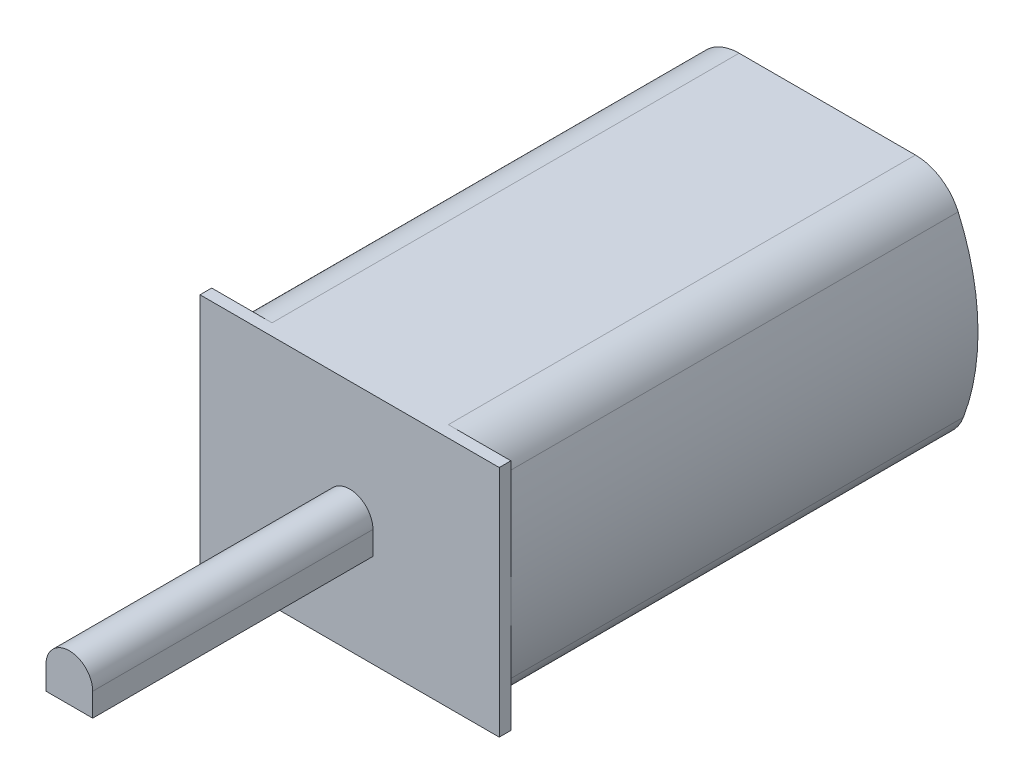
ISO-10303-21;
HEADER;
FILE_DESCRIPTION(('STEP AP214'),'2;1');
FILE_NAME('part.step','',(''),(''),'','','');
FILE_SCHEMA(('AUTOMOTIVE_DESIGN { 1 0 10303 214 1 1 1 1 }'));
ENDSEC;
DATA;
#1=APPLICATION_CONTEXT('core data for automotive mechanical design processes');
#2=APPLICATION_PROTOCOL_DEFINITION('international standard','automotive_design',2000,#1);
#3=PRODUCT_CONTEXT('',#1,'mechanical');
#4=PRODUCT('Part','Part','',(#3));
#5=PRODUCT_RELATED_PRODUCT_CATEGORY('part','',(#4));
#6=PRODUCT_DEFINITION_FORMATION('','',#4);
#7=PRODUCT_DEFINITION_CONTEXT('part definition',#1,'design');
#8=PRODUCT_DEFINITION('design','',#6,#7);
#9=PRODUCT_DEFINITION_SHAPE('','',#8);
#10=(LENGTH_UNIT() NAMED_UNIT(*) SI_UNIT(.MILLI.,.METRE.));
#11=(NAMED_UNIT(*) PLANE_ANGLE_UNIT() SI_UNIT($,.RADIAN.));
#12=(NAMED_UNIT(*) SI_UNIT($,.STERADIAN.) SOLID_ANGLE_UNIT());
#13=UNCERTAINTY_MEASURE_WITH_UNIT(LENGTH_MEASURE(1.E-05),#10,'distance_accuracy_value','');
#14=(GEOMETRIC_REPRESENTATION_CONTEXT(3) GLOBAL_UNCERTAINTY_ASSIGNED_CONTEXT((#13)) GLOBAL_UNIT_ASSIGNED_CONTEXT((#10,
#11,#12)) REPRESENTATION_CONTEXT('',''));
#15=CARTESIAN_POINT('',(0.,0.,0.));
#16=DIRECTION('',(0.,0.,1.));
#17=DIRECTION('',(1.,0.,0.));
#18=AXIS2_PLACEMENT_3D('',#15,#16,#17);
#19=CARTESIAN_POINT('',(8.79469161528333,8.,20.));
#20=DIRECTION('',(0.,0.,-1.));
#21=DIRECTION('',(-1.,0.,0.));
#22=AXIS2_PLACEMENT_3D('',#19,#20,#21);
#23=CYLINDRICAL_SURFACE('',#22,2.);
#24=CARTESIAN_POINT('',(8.79469161528333,8.,0.));
#25=DIRECTION('',(0.,0.,1.));
#26=DIRECTION('',(-1.,0.,0.));
#27=AXIS2_PLACEMENT_3D('',#24,#25,#26);
#28=CIRCLE('',#27,2.);
#29=CARTESIAN_POINT('',(10.6250293599266,8.80614126586724,0.));
#30=VERTEX_POINT('',#29);
#31=CARTESIAN_POINT('',(8.79469161528333,10.,0.));
#32=VERTEX_POINT('',#31);
#33=EDGE_CURVE('E223',#30,#32,#28,.T.);
#34=ORIENTED_EDGE('',*,*,#33,.T.);
#35=DIRECTION('',(0.,0.,-1.));
#36=VECTOR('',#35,1.);
#37=CARTESIAN_POINT('',(8.79469161528333,10.,20.));
#38=LINE('',#37,#36);
#39=CARTESIAN_POINT('',(8.79469161528333,10.,20.));
#40=VERTEX_POINT('',#39);
#41=EDGE_CURVE('E11',#40,#32,#38,.T.);
#42=ORIENTED_EDGE('',*,*,#41,.F.);
#43=CARTESIAN_POINT('',(8.79469161528333,8.,20.));
#44=DIRECTION('',(0.,0.,1.));
#45=DIRECTION('',(-1.,0.,0.));
#46=AXIS2_PLACEMENT_3D('',#43,#44,#45);
#47=CIRCLE('',#46,2.);
#48=CARTESIAN_POINT('',(10.6250293599266,8.80614126586724,20.));
#49=VERTEX_POINT('',#48);
#50=EDGE_CURVE('E224',#49,#40,#47,.T.);
#51=ORIENTED_EDGE('',*,*,#50,.F.);
#52=DIRECTION('',(0.,0.,-1.));
#53=VECTOR('',#52,1.);
#54=CARTESIAN_POINT('',(10.6250293599266,8.80614126586724,20.));
#55=LINE('',#54,#53);
#56=EDGE_CURVE('E243',#49,#30,#55,.T.);
#57=ORIENTED_EDGE('',*,*,#56,.T.);
#58=EDGE_LOOP('',(#34,#42,#51,#57));
#59=FACE_BOUND('',#58,.T.);
#60=ADVANCED_FACE('F36',(#59),#23,.T.);
#61=CARTESIAN_POINT('',(1.24405555074872,10.,20.));
#62=DIRECTION('',(0.,-1.,0.));
#63=DIRECTION('',(0.,0.,-1.));
#64=AXIS2_PLACEMENT_3D('',#61,#62,#63);
#65=PLANE('',#64);
#66=DIRECTION('',(-1.,0.,0.));
#67=VECTOR('',#66,1.);
#68=CARTESIAN_POINT('',(1.24405555074872,10.,0.));
#69=LINE('',#68,#67);
#70=CARTESIAN_POINT('',(1.24405555074872,10.,0.));
#71=VERTEX_POINT('',#70);
#72=EDGE_CURVE('E246',#32,#71,#69,.T.);
#73=ORIENTED_EDGE('',*,*,#72,.T.);
#74=DIRECTION('',(0.,0.,-1.));
#75=VECTOR('',#74,1.);
#76=CARTESIAN_POINT('',(1.24405555074872,10.,20.));
#77=LINE('',#76,#75);
#78=CARTESIAN_POINT('',(1.24405555074872,10.,20.));
#79=VERTEX_POINT('',#78);
#80=EDGE_CURVE('E43',#79,#71,#77,.T.);
#81=ORIENTED_EDGE('',*,*,#80,.F.);
#82=DIRECTION('',(1.,0.,0.));
#83=VECTOR('',#82,1.);
#84=CARTESIAN_POINT('',(0.,10.,20.));
#85=LINE('',#84,#83);
#86=CARTESIAN_POINT('',(-1.33974596215561,10.,20.));
#87=VERTEX_POINT('',#86);
#88=EDGE_CURVE('E203',#87,#79,#85,.T.);
#89=ORIENTED_EDGE('',*,*,#88,.F.);
#90=DIRECTION('',(0.,0.,-1.));
#91=VECTOR('',#90,1.);
#92=CARTESIAN_POINT('',(-1.33974596215561,10.,20.5));
#93=LINE('',#92,#91);
#94=CARTESIAN_POINT('',(-1.33974596215561,10.,20.5));
#95=VERTEX_POINT('',#94);
#96=EDGE_CURVE('E217',#95,#87,#93,.T.);
#97=ORIENTED_EDGE('',*,*,#96,.F.);
#98=DIRECTION('',(1.,0.,0.));
#99=VECTOR('',#98,1.);
#100=CARTESIAN_POINT('',(0.,10.,20.5));
#101=LINE('',#100,#99);
#102=CARTESIAN_POINT('',(11.4733406367101,10.,20.5));
#103=VERTEX_POINT('',#102);
#104=EDGE_CURVE('E191',#95,#103,#101,.T.);
#105=ORIENTED_EDGE('',*,*,#104,.T.);
#106=DIRECTION('',(0.,0.,-1.));
#107=VECTOR('',#106,1.);
#108=CARTESIAN_POINT('',(11.4733406367101,10.,20.5));
#109=LINE('',#108,#107);
#110=CARTESIAN_POINT('',(11.4733406367101,10.,20.));
#111=VERTEX_POINT('',#110);
#112=EDGE_CURVE('E220',#103,#111,#109,.T.);
#113=ORIENTED_EDGE('',*,*,#112,.T.);
#114=EDGE_CURVE('E202',#40,#111,#85,.T.);
#115=ORIENTED_EDGE('',*,*,#114,.F.);
#116=ORIENTED_EDGE('',*,*,#41,.T.);
#117=EDGE_LOOP('',(#73,#81,#89,#97,#105,#113,#115,#116));
#118=FACE_BOUND('',#117,.T.);
#119=ADVANCED_FACE('F306',(#118),#65,.F.);
#120=CARTESIAN_POINT('',(1.24405555074872,8.,20.));
#121=DIRECTION('',(0.,0.,-1.));
#122=DIRECTION('',(-1.,0.,0.));
#123=AXIS2_PLACEMENT_3D('',#120,#121,#122);
#124=CYLINDRICAL_SURFACE('',#123,2.);
#125=CARTESIAN_POINT('',(1.24405555074872,8.,0.));
#126=DIRECTION('',(0.,0.,1.));
#127=DIRECTION('',(-1.,0.,0.));
#128=AXIS2_PLACEMENT_3D('',#125,#126,#127);
#129=CIRCLE('',#128,2.);
#130=CARTESIAN_POINT('',(-0.609994071025193,8.75,0.));
#131=VERTEX_POINT('',#130);
#132=EDGE_CURVE('E248',#71,#131,#129,.T.);
#133=ORIENTED_EDGE('',*,*,#132,.T.);
#134=DIRECTION('',(0.,0.,-1.));
#135=VECTOR('',#134,1.);
#136=CARTESIAN_POINT('',(-0.609994071025193,8.75,20.));
#137=LINE('',#136,#135);
#138=CARTESIAN_POINT('',(-0.609994071025193,8.75,20.));
#139=VERTEX_POINT('',#138);
#140=EDGE_CURVE('E273',#139,#131,#137,.T.);
#141=ORIENTED_EDGE('',*,*,#140,.F.);
#142=CARTESIAN_POINT('',(1.24405555074872,8.,20.));
#143=DIRECTION('',(0.,0.,1.));
#144=DIRECTION('',(-1.,0.,0.));
#145=AXIS2_PLACEMENT_3D('',#142,#143,#144);
#146=CIRCLE('',#145,2.);
#147=EDGE_CURVE('E227',#79,#139,#146,.T.);
#148=ORIENTED_EDGE('',*,*,#147,.F.);
#149=ORIENTED_EDGE('',*,*,#80,.T.);
#150=EDGE_LOOP('',(#133,#141,#148,#149));
#151=FACE_BOUND('',#150,.T.);
#152=ADVANCED_FACE('F279',(#151),#124,.T.);
#153=CARTESIAN_POINT('',(8.66025403784439,5.,20.));
#154=DIRECTION('',(0.,0.,-1.));
#155=DIRECTION('',(-1.,0.,0.));
#156=AXIS2_PLACEMENT_3D('',#153,#154,#155);
#157=CYLINDRICAL_SURFACE('',#156,10.);
#158=CARTESIAN_POINT('',(8.66025403784439,5.,0.));
#159=DIRECTION('',(0.,0.,1.));
#160=DIRECTION('',(-1.,0.,0.));
#161=AXIS2_PLACEMENT_3D('',#158,#159,#160);
#162=CIRCLE('',#161,10.);
#163=CARTESIAN_POINT('',(-0.609994071025192,1.25,0.));
#164=VERTEX_POINT('',#163);
#165=EDGE_CURVE('E250',#131,#164,#162,.T.);
#166=ORIENTED_EDGE('',*,*,#165,.T.);
#167=DIRECTION('',(0.,0.,-1.));
#168=VECTOR('',#167,1.);
#169=CARTESIAN_POINT('',(-0.609994071025192,1.25,20.));
#170=LINE('',#169,#168);
#171=CARTESIAN_POINT('',(-0.609994071025192,1.25,20.));
#172=VERTEX_POINT('',#171);
#173=EDGE_CURVE('E270',#172,#164,#170,.T.);
#174=ORIENTED_EDGE('',*,*,#173,.F.);
#175=CARTESIAN_POINT('',(8.66025403784439,5.,20.));
#176=DIRECTION('',(0.,0.,1.));
#177=DIRECTION('',(-1.,0.,0.));
#178=AXIS2_PLACEMENT_3D('',#175,#176,#177);
#179=CIRCLE('',#178,10.);
#180=CARTESIAN_POINT('',(-1.33974596215561,5.,20.));
#181=VERTEX_POINT('',#180);
#182=EDGE_CURVE('E231',#181,#172,#179,.T.);
#183=ORIENTED_EDGE('',*,*,#182,.F.);
#184=EDGE_CURVE('E232',#139,#181,#179,.T.);
#185=ORIENTED_EDGE('',*,*,#184,.F.);
#186=ORIENTED_EDGE('',*,*,#140,.T.);
#187=EDGE_LOOP('',(#166,#174,#183,#185,#186));
#188=FACE_BOUND('',#187,.T.);
#189=ADVANCED_FACE('F289',(#188),#157,.T.);
#190=CARTESIAN_POINT('',(1.24405555074872,2.,20.));
#191=DIRECTION('',(0.,0.,-1.));
#192=DIRECTION('',(-1.,0.,0.));
#193=AXIS2_PLACEMENT_3D('',#190,#191,#192);
#194=CYLINDRICAL_SURFACE('',#193,2.);
#195=CARTESIAN_POINT('',(1.24405555074872,2.,0.));
#196=DIRECTION('',(0.,0.,1.));
#197=DIRECTION('',(-1.,0.,0.));
#198=AXIS2_PLACEMENT_3D('',#195,#196,#197);
#199=CIRCLE('',#198,2.);
#200=CARTESIAN_POINT('',(1.24405555074872,0.,0.));
#201=VERTEX_POINT('',#200);
#202=EDGE_CURVE('E252',#164,#201,#199,.T.);
#203=ORIENTED_EDGE('',*,*,#202,.T.);
#204=DIRECTION('',(0.,0.,-1.));
#205=VECTOR('',#204,1.);
#206=CARTESIAN_POINT('',(1.24405555074872,0.,20.));
#207=LINE('',#206,#205);
#208=CARTESIAN_POINT('',(1.24405555074872,0.,20.));
#209=VERTEX_POINT('',#208);
#210=EDGE_CURVE('E267',#209,#201,#207,.T.);
#211=ORIENTED_EDGE('',*,*,#210,.F.);
#212=CARTESIAN_POINT('',(1.24405555074872,2.,20.));
#213=DIRECTION('',(0.,0.,1.));
#214=DIRECTION('',(-1.,0.,0.));
#215=AXIS2_PLACEMENT_3D('',#212,#213,#214);
#216=CIRCLE('',#215,2.);
#217=EDGE_CURVE('E235',#172,#209,#216,.T.);
#218=ORIENTED_EDGE('',*,*,#217,.F.);
#219=ORIENTED_EDGE('',*,*,#173,.T.);
#220=EDGE_LOOP('',(#203,#211,#218,#219));
#221=FACE_BOUND('',#220,.T.);
#222=ADVANCED_FACE('F293',(#221),#194,.T.);
#223=CARTESIAN_POINT('',(1.24405555074872,0.,20.));
#224=DIRECTION('',(0.,1.,0.));
#225=DIRECTION('',(0.,0.,1.));
#226=AXIS2_PLACEMENT_3D('',#223,#224,#225);
#227=PLANE('',#226);
#228=DIRECTION('',(1.,0.,0.));
#229=VECTOR('',#228,1.);
#230=CARTESIAN_POINT('',(1.24405555074872,0.,0.));
#231=LINE('',#230,#229);
#232=CARTESIAN_POINT('',(8.97647071109124,0.,0.));
#233=VERTEX_POINT('',#232);
#234=EDGE_CURVE('E254',#201,#233,#231,.T.);
#235=ORIENTED_EDGE('',*,*,#234,.T.);
#236=DIRECTION('',(0.,0.,-1.));
#237=VECTOR('',#236,1.);
#238=CARTESIAN_POINT('',(8.97647071109124,0.,20.));
#239=LINE('',#238,#237);
#240=CARTESIAN_POINT('',(8.97647071109124,0.,20.));
#241=VERTEX_POINT('',#240);
#242=EDGE_CURVE('E264',#241,#233,#239,.T.);
#243=ORIENTED_EDGE('',*,*,#242,.F.);
#244=DIRECTION('',(1.,0.,0.));
#245=VECTOR('',#244,1.);
#246=CARTESIAN_POINT('',(0.,0.,20.));
#247=LINE('',#246,#245);
#248=CARTESIAN_POINT('',(11.4733406367101,0.,20.));
#249=VERTEX_POINT('',#248);
#250=EDGE_CURVE('E210',#241,#249,#247,.T.);
#251=ORIENTED_EDGE('',*,*,#250,.T.);
#252=DIRECTION('',(0.,0.,-1.));
#253=VECTOR('',#252,1.);
#254=CARTESIAN_POINT('',(11.4733406367101,0.,20.5));
#255=LINE('',#254,#253);
#256=CARTESIAN_POINT('',(11.4733406367101,0.,20.5));
#257=VERTEX_POINT('',#256);
#258=EDGE_CURVE('E199',#257,#249,#255,.T.);
#259=ORIENTED_EDGE('',*,*,#258,.F.);
#260=DIRECTION('',(1.,0.,0.));
#261=VECTOR('',#260,1.);
#262=CARTESIAN_POINT('',(0.,0.,20.5));
#263=LINE('',#262,#261);
#264=CARTESIAN_POINT('',(-1.33974596215561,0.,20.5));
#265=VERTEX_POINT('',#264);
#266=EDGE_CURVE('E198',#265,#257,#263,.T.);
#267=ORIENTED_EDGE('',*,*,#266,.F.);
#268=DIRECTION('',(0.,0.,-1.));
#269=VECTOR('',#268,1.);
#270=CARTESIAN_POINT('',(-1.33974596215561,0.,20.5));
#271=LINE('',#270,#269);
#272=CARTESIAN_POINT('',(-1.33974596215561,0.,20.));
#273=VERTEX_POINT('',#272);
#274=EDGE_CURVE('E215',#265,#273,#271,.T.);
#275=ORIENTED_EDGE('',*,*,#274,.T.);
#276=EDGE_CURVE('E192',#273,#209,#247,.T.);
#277=ORIENTED_EDGE('',*,*,#276,.T.);
#278=ORIENTED_EDGE('',*,*,#210,.T.);
#279=EDGE_LOOP('',(#235,#243,#251,#259,#267,#275,#277,#278));
#280=FACE_BOUND('',#279,.T.);
#281=ADVANCED_FACE('F319',(#280),#227,.F.);
#282=CARTESIAN_POINT('',(8.97647071109124,2.,20.));
#283=DIRECTION('',(0.,0.,-1.));
#284=DIRECTION('',(-1.,0.,0.));
#285=AXIS2_PLACEMENT_3D('',#282,#283,#284);
#286=CYLINDRICAL_SURFACE('',#285,2.);
#287=CARTESIAN_POINT('',(8.97647071109124,2.,0.));
#288=DIRECTION('',(0.,0.,1.));
#289=DIRECTION('',(1.,0.,0.));
#290=AXIS2_PLACEMENT_3D('',#287,#288,#289);
#291=CIRCLE('',#290,2.);
#292=CARTESIAN_POINT('',(10.8522532296865,1.30614126586724,0.));
#293=VERTEX_POINT('',#292);
#294=EDGE_CURVE('E256',#233,#293,#291,.T.);
#295=ORIENTED_EDGE('',*,*,#294,.T.);
#296=DIRECTION('',(0.,0.,-1.));
#297=VECTOR('',#296,1.);
#298=CARTESIAN_POINT('',(10.8522532296865,1.30614126586724,20.));
#299=LINE('',#298,#297);
#300=CARTESIAN_POINT('',(10.8522532296865,1.30614126586724,20.));
#301=VERTEX_POINT('',#300);
#302=EDGE_CURVE('E261',#301,#293,#299,.T.);
#303=ORIENTED_EDGE('',*,*,#302,.F.);
#304=CARTESIAN_POINT('',(8.97647071109124,2.,20.));
#305=DIRECTION('',(0.,0.,1.));
#306=DIRECTION('',(1.,0.,0.));
#307=AXIS2_PLACEMENT_3D('',#304,#305,#306);
#308=CIRCLE('',#307,2.);
#309=EDGE_CURVE('E238',#241,#301,#308,.T.);
#310=ORIENTED_EDGE('',*,*,#309,.F.);
#311=ORIENTED_EDGE('',*,*,#242,.T.);
#312=EDGE_LOOP('',(#295,#303,#310,#311));
#313=FACE_BOUND('',#312,.T.);
#314=ADVANCED_FACE('F322',(#313),#286,.T.);
#315=CARTESIAN_POINT('',(1.47334063671008,4.77543493653104,20.));
#316=DIRECTION('',(0.,0.,-1.));
#317=DIRECTION('',(-1.,0.,0.));
#318=AXIS2_PLACEMENT_3D('',#315,#316,#317);
#319=CYLINDRICAL_SURFACE('',#318,10.);
#320=CARTESIAN_POINT('',(1.47334063671008,4.77543493653104,0.));
#321=DIRECTION('',(0.,0.,1.));
#322=DIRECTION('',(1.,0.,0.));
#323=AXIS2_PLACEMENT_3D('',#320,#321,#322);
#324=CIRCLE('',#323,10.);
#325=EDGE_CURVE('E228',#293,#30,#324,.T.);
#326=ORIENTED_EDGE('',*,*,#325,.T.);
#327=ORIENTED_EDGE('',*,*,#56,.F.);
#328=CARTESIAN_POINT('',(1.47334063671008,4.77543493653104,20.));
#329=DIRECTION('',(0.,0.,1.));
#330=DIRECTION('',(1.,0.,0.));
#331=AXIS2_PLACEMENT_3D('',#328,#329,#330);
#332=CIRCLE('',#331,10.);
#333=CARTESIAN_POINT('',(11.4733406367101,4.77543493653104,20.));
#334=VERTEX_POINT('',#333);
#335=EDGE_CURVE('E58',#334,#49,#332,.T.);
#336=ORIENTED_EDGE('',*,*,#335,.F.);
#337=EDGE_CURVE('E241',#301,#334,#332,.T.);
#338=ORIENTED_EDGE('',*,*,#337,.F.);
#339=ORIENTED_EDGE('',*,*,#302,.T.);
#340=EDGE_LOOP('',(#326,#327,#336,#338,#339));
#341=FACE_BOUND('',#340,.T.);
#342=ADVANCED_FACE('F326',(#341),#319,.T.);
#343=CARTESIAN_POINT('',(8.79469161528333,8.,0.));
#344=DIRECTION('',(0.,0.,-1.));
#345=DIRECTION('',(-1.,0.,0.));
#346=AXIS2_PLACEMENT_3D('',#343,#344,#345);
#347=PLANE('',#346);
#348=ORIENTED_EDGE('',*,*,#33,.F.);
#349=ORIENTED_EDGE('',*,*,#325,.F.);
#350=ORIENTED_EDGE('',*,*,#294,.F.);
#351=ORIENTED_EDGE('',*,*,#234,.F.);
#352=ORIENTED_EDGE('',*,*,#202,.F.);
#353=ORIENTED_EDGE('',*,*,#165,.F.);
#354=ORIENTED_EDGE('',*,*,#132,.F.);
#355=ORIENTED_EDGE('',*,*,#72,.F.);
#356=EDGE_LOOP('',(#348,#349,#350,#351,#352,#353,#354,#355));
#357=FACE_BOUND('',#356,.T.);
#358=ADVANCED_FACE('F285',(#357),#347,.T.);
#359=CARTESIAN_POINT('',(0.,0.,20.));
#360=DIRECTION('',(0.,0.,1.));
#361=DIRECTION('',(1.,0.,0.));
#362=AXIS2_PLACEMENT_3D('',#359,#360,#361);
#363=PLANE('',#362);
#364=ORIENTED_EDGE('',*,*,#88,.T.);
#365=ORIENTED_EDGE('',*,*,#147,.T.);
#366=ORIENTED_EDGE('',*,*,#184,.T.);
#367=DIRECTION('',(0.,1.,0.));
#368=VECTOR('',#367,1.);
#369=CARTESIAN_POINT('',(-1.33974596215561,0.,20.));
#370=LINE('',#369,#368);
#371=EDGE_CURVE('E206',#181,#87,#370,.T.);
#372=ORIENTED_EDGE('',*,*,#371,.T.);
#373=EDGE_LOOP('',(#364,#365,#366,#372));
#374=FACE_BOUND('',#373,.T.);
#375=ADVANCED_FACE('F301',(#374),#363,.F.);
#376=EDGE_CURVE('E207',#273,#181,#370,.T.);
#377=ORIENTED_EDGE('',*,*,#376,.T.);
#378=ORIENTED_EDGE('',*,*,#182,.T.);
#379=ORIENTED_EDGE('',*,*,#217,.T.);
#380=ORIENTED_EDGE('',*,*,#276,.F.);
#381=EDGE_LOOP('',(#377,#378,#379,#380));
#382=FACE_BOUND('',#381,.T.);
#383=ADVANCED_FACE('F297',(#382),#363,.F.);
#384=ORIENTED_EDGE('',*,*,#335,.T.);
#385=ORIENTED_EDGE('',*,*,#50,.T.);
#386=ORIENTED_EDGE('',*,*,#114,.T.);
#387=DIRECTION('',(0.,1.,0.));
#388=VECTOR('',#387,1.);
#389=CARTESIAN_POINT('',(11.4733406367101,0.,20.));
#390=LINE('',#389,#388);
#391=EDGE_CURVE('E181',#334,#111,#390,.T.);
#392=ORIENTED_EDGE('',*,*,#391,.F.);
#393=EDGE_LOOP('',(#384,#385,#386,#392));
#394=FACE_BOUND('',#393,.T.);
#395=ADVANCED_FACE('F395',(#394),#363,.F.);
#396=ORIENTED_EDGE('',*,*,#250,.F.);
#397=ORIENTED_EDGE('',*,*,#309,.T.);
#398=ORIENTED_EDGE('',*,*,#337,.T.);
#399=EDGE_CURVE('E184',#249,#334,#390,.T.);
#400=ORIENTED_EDGE('',*,*,#399,.F.);
#401=EDGE_LOOP('',(#396,#397,#398,#400));
#402=FACE_BOUND('',#401,.T.);
#403=ADVANCED_FACE('F335',(#402),#363,.F.);
#404=CARTESIAN_POINT('',(11.4733406367101,0.,20.5));
#405=DIRECTION('',(-1.,0.,0.));
#406=DIRECTION('',(0.,0.,1.));
#407=AXIS2_PLACEMENT_3D('',#404,#405,#406);
#408=PLANE('',#407);
#409=ORIENTED_EDGE('',*,*,#399,.T.);
#410=ORIENTED_EDGE('',*,*,#391,.T.);
#411=ORIENTED_EDGE('',*,*,#112,.F.);
#412=DIRECTION('',(0.,1.,0.));
#413=VECTOR('',#412,1.);
#414=CARTESIAN_POINT('',(11.4733406367101,0.,20.5));
#415=LINE('',#414,#413);
#416=EDGE_CURVE('E189',#257,#103,#415,.T.);
#417=ORIENTED_EDGE('',*,*,#416,.F.);
#418=ORIENTED_EDGE('',*,*,#258,.T.);
#419=EDGE_LOOP('',(#409,#410,#411,#417,#418));
#420=FACE_BOUND('',#419,.T.);
#421=ADVANCED_FACE('F332',(#420),#408,.F.);
#422=CARTESIAN_POINT('',(-1.33974596215561,0.,20.5));
#423=DIRECTION('',(-1.,0.,0.));
#424=DIRECTION('',(0.,0.,1.));
#425=AXIS2_PLACEMENT_3D('',#422,#423,#424);
#426=PLANE('',#425);
#427=ORIENTED_EDGE('',*,*,#376,.F.);
#428=ORIENTED_EDGE('',*,*,#274,.F.);
#429=DIRECTION('',(0.,1.,0.));
#430=VECTOR('',#429,1.);
#431=CARTESIAN_POINT('',(-1.33974596215561,0.,20.5));
#432=LINE('',#431,#430);
#433=EDGE_CURVE('E195',#265,#95,#432,.T.);
#434=ORIENTED_EDGE('',*,*,#433,.T.);
#435=ORIENTED_EDGE('',*,*,#96,.T.);
#436=ORIENTED_EDGE('',*,*,#371,.F.);
#437=EDGE_LOOP('',(#427,#428,#434,#435,#436));
#438=FACE_BOUND('',#437,.T.);
#439=ADVANCED_FACE('F303',(#438),#426,.T.);
#440=CARTESIAN_POINT('',(0.,0.,20.5));
#441=DIRECTION('',(0.,0.,1.));
#442=DIRECTION('',(1.,0.,0.));
#443=AXIS2_PLACEMENT_3D('',#440,#441,#442);
#444=PLANE('',#443);
#445=DIRECTION('',(1.,0.,0.));
#446=VECTOR('',#445,1.);
#447=CARTESIAN_POINT('',(4.06525403784439,4.,20.5));
#448=LINE('',#447,#446);
#449=CARTESIAN_POINT('',(4.06525403784439,4.,20.5));
#450=VERTEX_POINT('',#449);
#451=CARTESIAN_POINT('',(6.06525403784439,4.,20.5));
#452=VERTEX_POINT('',#451);
#453=EDGE_CURVE('E545',#450,#452,#448,.T.);
#454=ORIENTED_EDGE('',*,*,#453,.F.);
#455=DIRECTION('',(0.,-1.,0.));
#456=VECTOR('',#455,1.);
#457=CARTESIAN_POINT('',(4.06525403784439,5.,20.5));
#458=LINE('',#457,#456);
#459=CARTESIAN_POINT('',(4.06525403784439,5.,20.5));
#460=VERTEX_POINT('',#459);
#461=EDGE_CURVE('E179',#460,#450,#458,.T.);
#462=ORIENTED_EDGE('',*,*,#461,.F.);
#463=CARTESIAN_POINT('',(5.06525403784439,5.,20.5));
#464=DIRECTION('',(0.,0.,1.));
#465=DIRECTION('',(1.,0.,0.));
#466=AXIS2_PLACEMENT_3D('',#463,#464,#465);
#467=CIRCLE('',#466,1.);
#468=CARTESIAN_POINT('',(6.06525403784439,5.,20.5));
#469=VERTEX_POINT('',#468);
#470=EDGE_CURVE('E175',#469,#460,#467,.T.);
#471=ORIENTED_EDGE('',*,*,#470,.F.);
#472=DIRECTION('',(0.,1.,0.));
#473=VECTOR('',#472,1.);
#474=CARTESIAN_POINT('',(6.06525403784439,4.,20.5));
#475=LINE('',#474,#473);
#476=EDGE_CURVE('E542',#452,#469,#475,.T.);
#477=ORIENTED_EDGE('',*,*,#476,.F.);
#478=EDGE_LOOP('',(#454,#462,#471,#477));
#479=FACE_BOUND('',#478,.T.);
#480=ORIENTED_EDGE('',*,*,#416,.T.);
#481=ORIENTED_EDGE('',*,*,#104,.F.);
#482=ORIENTED_EDGE('',*,*,#433,.F.);
#483=ORIENTED_EDGE('',*,*,#266,.T.);
#484=EDGE_LOOP('',(#480,#481,#482,#483));
#485=FACE_BOUND('',#484,.T.);
#486=ADVANCED_FACE('F339',(#479,#485),#444,.T.);
#487=CARTESIAN_POINT('',(4.06525403784439,5.,32.5));
#488=DIRECTION('',(1.,0.,0.));
#489=DIRECTION('',(0.,0.,-1.));
#490=AXIS2_PLACEMENT_3D('',#487,#488,#489);
#491=PLANE('',#490);
#492=ORIENTED_EDGE('',*,*,#461,.T.);
#493=DIRECTION('',(0.,0.,-1.));
#494=VECTOR('',#493,1.);
#495=CARTESIAN_POINT('',(4.06525403784439,4.,32.5));
#496=LINE('',#495,#494);
#497=CARTESIAN_POINT('',(4.06525403784439,4.,32.5));
#498=VERTEX_POINT('',#497);
#499=EDGE_CURVE('E160',#498,#450,#496,.T.);
#500=ORIENTED_EDGE('',*,*,#499,.F.);
#501=DIRECTION('',(0.,-1.,0.));
#502=VECTOR('',#501,1.);
#503=CARTESIAN_POINT('',(4.06525403784439,5.,32.5));
#504=LINE('',#503,#502);
#505=CARTESIAN_POINT('',(4.06525403784439,5.,32.5));
#506=VERTEX_POINT('',#505);
#507=EDGE_CURVE('E167',#506,#498,#504,.T.);
#508=ORIENTED_EDGE('',*,*,#507,.F.);
#509=DIRECTION('',(0.,0.,-1.));
#510=VECTOR('',#509,1.);
#511=CARTESIAN_POINT('',(4.06525403784439,5.,32.5));
#512=LINE('',#511,#510);
#513=EDGE_CURVE('E540',#506,#460,#512,.T.);
#514=ORIENTED_EDGE('',*,*,#513,.T.);
#515=EDGE_LOOP('',(#492,#500,#508,#514));
#516=FACE_BOUND('',#515,.T.);
#517=ADVANCED_FACE('F177',(#516),#491,.F.);
#518=CARTESIAN_POINT('',(4.06525403784439,4.,32.5));
#519=DIRECTION('',(0.,1.,0.));
#520=DIRECTION('',(-1.,0.,0.));
#521=AXIS2_PLACEMENT_3D('',#518,#519,#520);
#522=PLANE('',#521);
#523=ORIENTED_EDGE('',*,*,#453,.T.);
#524=DIRECTION('',(0.,0.,-1.));
#525=VECTOR('',#524,1.);
#526=CARTESIAN_POINT('',(6.06525403784439,4.,32.5));
#527=LINE('',#526,#525);
#528=CARTESIAN_POINT('',(6.06525403784439,4.,32.5));
#529=VERTEX_POINT('',#528);
#530=EDGE_CURVE('E163',#529,#452,#527,.T.);
#531=ORIENTED_EDGE('',*,*,#530,.F.);
#532=DIRECTION('',(1.,0.,0.));
#533=VECTOR('',#532,1.);
#534=CARTESIAN_POINT('',(4.06525403784439,4.,32.5));
#535=LINE('',#534,#533);
#536=EDGE_CURVE('E156',#498,#529,#535,.T.);
#537=ORIENTED_EDGE('',*,*,#536,.F.);
#538=ORIENTED_EDGE('',*,*,#499,.T.);
#539=EDGE_LOOP('',(#523,#531,#537,#538));
#540=FACE_BOUND('',#539,.T.);
#541=ADVANCED_FACE('F158',(#540),#522,.F.);
#542=CARTESIAN_POINT('',(6.06525403784439,4.,32.5));
#543=DIRECTION('',(-1.,0.,0.));
#544=DIRECTION('',(0.,0.,1.));
#545=AXIS2_PLACEMENT_3D('',#542,#543,#544);
#546=PLANE('',#545);
#547=ORIENTED_EDGE('',*,*,#476,.T.);
#548=DIRECTION('',(0.,0.,-1.));
#549=VECTOR('',#548,1.);
#550=CARTESIAN_POINT('',(6.06525403784439,5.,32.5));
#551=LINE('',#550,#549);
#552=CARTESIAN_POINT('',(6.06525403784439,5.,32.5));
#553=VERTEX_POINT('',#552);
#554=EDGE_CURVE('E50',#553,#469,#551,.T.);
#555=ORIENTED_EDGE('',*,*,#554,.F.);
#556=DIRECTION('',(0.,1.,0.));
#557=VECTOR('',#556,1.);
#558=CARTESIAN_POINT('',(6.06525403784439,4.,32.5));
#559=LINE('',#558,#557);
#560=EDGE_CURVE('E166',#529,#553,#559,.T.);
#561=ORIENTED_EDGE('',*,*,#560,.F.);
#562=ORIENTED_EDGE('',*,*,#530,.T.);
#563=EDGE_LOOP('',(#547,#555,#561,#562));
#564=FACE_BOUND('',#563,.T.);
#565=ADVANCED_FACE('F349',(#564),#546,.F.);
#566=CARTESIAN_POINT('',(5.06525403784439,5.,32.5));
#567=DIRECTION('',(0.,0.,-1.));
#568=DIRECTION('',(-1.,0.,0.));
#569=AXIS2_PLACEMENT_3D('',#566,#567,#568);
#570=CYLINDRICAL_SURFACE('',#569,1.);
#571=ORIENTED_EDGE('',*,*,#470,.T.);
#572=ORIENTED_EDGE('',*,*,#513,.F.);
#573=CARTESIAN_POINT('',(5.06525403784439,5.,32.5));
#574=DIRECTION('',(0.,0.,1.));
#575=DIRECTION('',(1.,0.,0.));
#576=AXIS2_PLACEMENT_3D('',#573,#574,#575);
#577=CIRCLE('',#576,1.);
#578=EDGE_CURVE('E171',#553,#506,#577,.T.);
#579=ORIENTED_EDGE('',*,*,#578,.F.);
#580=ORIENTED_EDGE('',*,*,#554,.T.);
#581=EDGE_LOOP('',(#571,#572,#579,#580));
#582=FACE_BOUND('',#581,.T.);
#583=ADVANCED_FACE('F352',(#582),#570,.T.);
#584=CARTESIAN_POINT('',(5.06525403784439,5.,32.5));
#585=DIRECTION('',(0.,0.,1.));
#586=DIRECTION('',(1.,0.,0.));
#587=AXIS2_PLACEMENT_3D('',#584,#585,#586);
#588=PLANE('',#587);
#589=ORIENTED_EDGE('',*,*,#507,.T.);
#590=ORIENTED_EDGE('',*,*,#536,.T.);
#591=ORIENTED_EDGE('',*,*,#560,.T.);
#592=ORIENTED_EDGE('',*,*,#578,.T.);
#593=EDGE_LOOP('',(#589,#590,#591,#592));
#594=FACE_BOUND('',#593,.T.);
#595=ADVANCED_FACE('F170',(#594),#588,.T.);
#596=CLOSED_SHELL('',(#60,#119,#152,#189,#222,#281,#314,#342,#358,#375,#383,#395,#403,#421,#439,
#486,#517,#541,#565,#583,#595));
#597=MANIFOLD_SOLID_BREP('B2',#596);
#598=ADVANCED_BREP_SHAPE_REPRESENTATION('',(#18,#597),#14);
#599=SHAPE_DEFINITION_REPRESENTATION(#9,#598);
ENDSEC;
END-ISO-10303-21;
